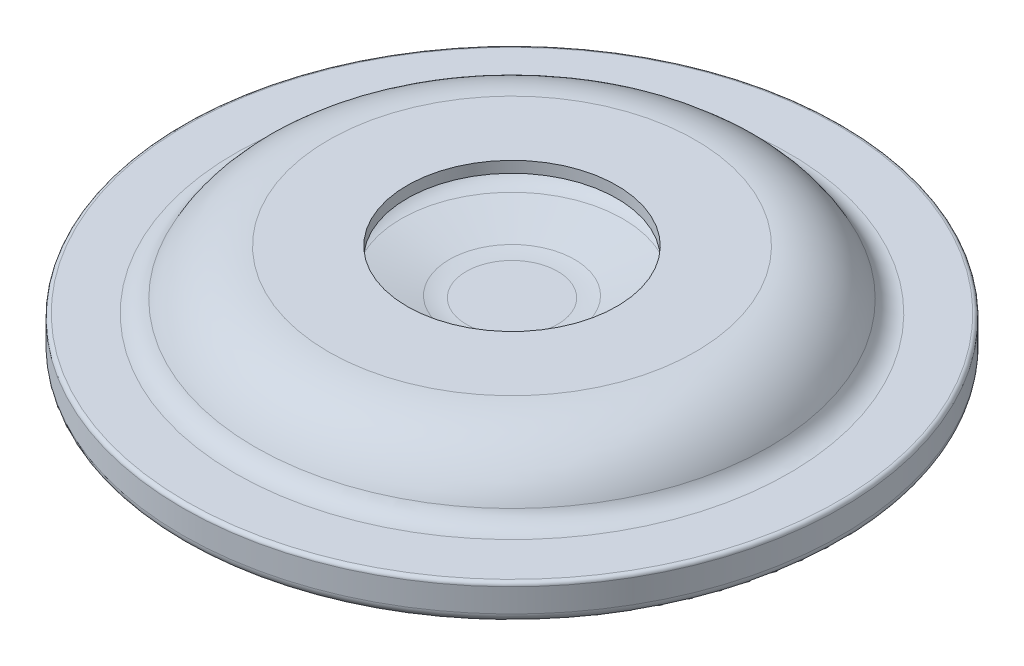
ISO-10303-21;
HEADER;
FILE_DESCRIPTION(('STEP AP214'),'2;1');
FILE_NAME('part.step','',(''),(''),'','','');
FILE_SCHEMA(('AUTOMOTIVE_DESIGN { 1 0 10303 214 1 1 1 1 }'));
ENDSEC;
DATA;
#1=APPLICATION_CONTEXT('core data for automotive mechanical design processes');
#2=APPLICATION_PROTOCOL_DEFINITION('international standard','automotive_design',2000,#1);
#3=PRODUCT_CONTEXT('',#1,'mechanical');
#4=PRODUCT('Part','Part','',(#3));
#5=PRODUCT_RELATED_PRODUCT_CATEGORY('part','',(#4));
#6=PRODUCT_DEFINITION_FORMATION('','',#4);
#7=PRODUCT_DEFINITION_CONTEXT('part definition',#1,'design');
#8=PRODUCT_DEFINITION('design','',#6,#7);
#9=PRODUCT_DEFINITION_SHAPE('','',#8);
#10=(LENGTH_UNIT() NAMED_UNIT(*) SI_UNIT(.MILLI.,.METRE.));
#11=(NAMED_UNIT(*) PLANE_ANGLE_UNIT() SI_UNIT($,.RADIAN.));
#12=(NAMED_UNIT(*) SI_UNIT($,.STERADIAN.) SOLID_ANGLE_UNIT());
#13=UNCERTAINTY_MEASURE_WITH_UNIT(LENGTH_MEASURE(1.E-05),#10,'distance_accuracy_value','');
#14=(GEOMETRIC_REPRESENTATION_CONTEXT(3) GLOBAL_UNCERTAINTY_ASSIGNED_CONTEXT((#13)) GLOBAL_UNIT_ASSIGNED_CONTEXT((#10,
#11,#12)) REPRESENTATION_CONTEXT('',''));
#15=CARTESIAN_POINT('',(0.,0.,0.));
#16=DIRECTION('',(0.,0.,1.));
#17=DIRECTION('',(1.,0.,0.));
#18=AXIS2_PLACEMENT_3D('',#15,#16,#17);
#19=CARTESIAN_POINT('',(0.,-5.45,0.));
#20=DIRECTION('',(0.,1.,0.));
#21=DIRECTION('',(0.,0.,1.));
#22=AXIS2_PLACEMENT_3D('',#19,#20,#21);
#23=TOROIDAL_SURFACE('',#22,42.75,1.25);
#24=CARTESIAN_POINT('',(0.,-5.45,0.));
#25=DIRECTION('',(0.,1.,0.));
#26=DIRECTION('',(0.,0.,1.));
#27=AXIS2_PLACEMENT_3D('',#24,#25,#26);
#28=CIRCLE('',#27,44.);
#29=CARTESIAN_POINT('',(0.,-5.45,44.));
#30=VERTEX_POINT('',#29);
#31=EDGE_CURVE('E121',#30,#30,#28,.T.);
#32=ORIENTED_EDGE('',*,*,#31,.F.);
#33=EDGE_LOOP('',(#32));
#34=FACE_BOUND('',#33,.T.);
#35=CARTESIAN_POINT('',(0.,-6.7,0.));
#36=DIRECTION('',(0.,1.,0.));
#37=DIRECTION('',(0.,0.,1.));
#38=AXIS2_PLACEMENT_3D('',#35,#36,#37);
#39=CIRCLE('',#38,42.75);
#40=CARTESIAN_POINT('',(0.,-6.7,42.75));
#41=VERTEX_POINT('',#40);
#42=EDGE_CURVE('E10',#41,#41,#39,.T.);
#43=ORIENTED_EDGE('',*,*,#42,.T.);
#44=EDGE_LOOP('',(#43));
#45=FACE_BOUND('',#44,.T.);
#46=ADVANCED_FACE('F39',(#34,#45),#23,.T.);
#47=CARTESIAN_POINT('',(39.5,-6.7,0.));
#48=DIRECTION('',(0.,1.,0.));
#49=DIRECTION('',(0.,0.,1.));
#50=AXIS2_PLACEMENT_3D('',#47,#48,#49);
#51=PLANE('',#50);
#52=ORIENTED_EDGE('',*,*,#42,.F.);
#53=EDGE_LOOP('',(#52));
#54=FACE_BOUND('',#53,.T.);
#55=CARTESIAN_POINT('',(0.,-6.7,0.));
#56=DIRECTION('',(0.,1.,0.));
#57=DIRECTION('',(0.,0.,1.));
#58=AXIS2_PLACEMENT_3D('',#55,#56,#57);
#59=CIRCLE('',#58,39.5);
#60=CARTESIAN_POINT('',(0.,-6.7,39.5));
#61=VERTEX_POINT('',#60);
#62=EDGE_CURVE('E45',#61,#61,#59,.T.);
#63=ORIENTED_EDGE('',*,*,#62,.T.);
#64=EDGE_LOOP('',(#63));
#65=FACE_BOUND('',#64,.T.);
#66=ADVANCED_FACE('F128',(#54,#65),#51,.F.);
#67=CARTESIAN_POINT('',(0.,-6.2,0.));
#68=DIRECTION('',(0.,1.,0.));
#69=DIRECTION('',(0.,0.,1.));
#70=AXIS2_PLACEMENT_3D('',#67,#68,#69);
#71=TOROIDAL_SURFACE('',#70,39.5,0.5);
#72=ORIENTED_EDGE('',*,*,#62,.F.);
#73=EDGE_LOOP('',(#72));
#74=FACE_BOUND('',#73,.T.);
#75=CARTESIAN_POINT('',(0.,-6.2,0.));
#76=DIRECTION('',(0.,1.,0.));
#77=DIRECTION('',(0.,0.,1.));
#78=AXIS2_PLACEMENT_3D('',#75,#76,#77);
#79=CIRCLE('',#78,39.);
#80=CARTESIAN_POINT('',(0.,-6.2,39.));
#81=VERTEX_POINT('',#80);
#82=EDGE_CURVE('E49',#81,#81,#79,.T.);
#83=ORIENTED_EDGE('',*,*,#82,.T.);
#84=EDGE_LOOP('',(#83));
#85=FACE_BOUND('',#84,.T.);
#86=ADVANCED_FACE('F132',(#74,#85),#71,.T.);
#87=CARTESIAN_POINT('',(0.,0.,0.));
#88=DIRECTION('',(0.,1.,0.));
#89=DIRECTION('',(0.,0.,1.));
#90=AXIS2_PLACEMENT_3D('',#87,#88,#89);
#91=CYLINDRICAL_SURFACE('',#90,39.);
#92=ORIENTED_EDGE('',*,*,#82,.F.);
#93=EDGE_LOOP('',(#92));
#94=FACE_BOUND('',#93,.T.);
#95=CARTESIAN_POINT('',(0.,-4.55,0.));
#96=DIRECTION('',(0.,1.,0.));
#97=DIRECTION('',(0.,0.,1.));
#98=AXIS2_PLACEMENT_3D('',#95,#96,#97);
#99=CIRCLE('',#98,39.);
#100=CARTESIAN_POINT('',(0.,-4.55,39.));
#101=VERTEX_POINT('',#100);
#102=EDGE_CURVE('E53',#101,#101,#99,.T.);
#103=ORIENTED_EDGE('',*,*,#102,.T.);
#104=EDGE_LOOP('',(#103));
#105=FACE_BOUND('',#104,.T.);
#106=ADVANCED_FACE('F137',(#94,#105),#91,.F.);
#107=CARTESIAN_POINT('',(0.,-4.55,0.));
#108=DIRECTION('',(0.,1.,0.));
#109=DIRECTION('',(0.,0.,1.));
#110=AXIS2_PLACEMENT_3D('',#107,#108,#109);
#111=TOROIDAL_SURFACE('',#110,37.75,1.25);
#112=ORIENTED_EDGE('',*,*,#102,.F.);
#113=EDGE_LOOP('',(#112));
#114=FACE_BOUND('',#113,.T.);
#115=CARTESIAN_POINT('',(0.,-3.3,0.));
#116=DIRECTION('',(0.,1.,0.));
#117=DIRECTION('',(0.,0.,1.));
#118=AXIS2_PLACEMENT_3D('',#115,#116,#117);
#119=CIRCLE('',#118,37.75);
#120=CARTESIAN_POINT('',(0.,-3.3,37.75));
#121=VERTEX_POINT('',#120);
#122=EDGE_CURVE('E58',#121,#121,#119,.T.);
#123=ORIENTED_EDGE('',*,*,#122,.T.);
#124=EDGE_LOOP('',(#123));
#125=FACE_BOUND('',#124,.T.);
#126=ADVANCED_FACE('F143',(#114,#125),#111,.F.);
#127=CARTESIAN_POINT('',(37.75,-3.3,0.));
#128=DIRECTION('',(0.,1.,0.));
#129=DIRECTION('',(0.,0.,1.));
#130=AXIS2_PLACEMENT_3D('',#127,#128,#129);
#131=PLANE('',#130);
#132=ORIENTED_EDGE('',*,*,#122,.F.);
#133=EDGE_LOOP('',(#132));
#134=FACE_BOUND('',#133,.T.);
#135=CARTESIAN_POINT('',(0.,-3.3,0.));
#136=DIRECTION('',(0.,1.,0.));
#137=DIRECTION('',(0.,0.,1.));
#138=AXIS2_PLACEMENT_3D('',#135,#136,#137);
#139=CIRCLE('',#138,36.7342603844383);
#140=CARTESIAN_POINT('',(0.,-3.3,36.7342603844383));
#141=VERTEX_POINT('',#140);
#142=EDGE_CURVE('E61',#141,#141,#139,.T.);
#143=ORIENTED_EDGE('',*,*,#142,.T.);
#144=EDGE_LOOP('',(#143));
#145=FACE_BOUND('',#144,.T.);
#146=ADVANCED_FACE('F147',(#134,#145),#131,.F.);
#147=CARTESIAN_POINT('',(0.,1.2,0.));
#148=DIRECTION('',(0.,1.,0.));
#149=DIRECTION('',(0.,0.,1.));
#150=AXIS2_PLACEMENT_3D('',#147,#148,#149);
#151=TOROIDAL_SURFACE('',#150,36.7342603844383,4.5);
#152=ORIENTED_EDGE('',*,*,#142,.F.);
#153=EDGE_LOOP('',(#152));
#154=FACE_BOUND('',#153,.T.);
#155=CARTESIAN_POINT('',(0.,-0.983606557377049,0.));
#156=DIRECTION('',(0.,1.,0.));
#157=DIRECTION('',(0.,0.,1.));
#158=AXIS2_PLACEMENT_3D('',#155,#156,#157);
#159=CIRCLE('',#158,32.7995605988663);
#160=CARTESIAN_POINT('',(0.,-0.983606557377049,32.7995605988663));
#161=VERTEX_POINT('',#160);
#162=EDGE_CURVE('E64',#161,#161,#159,.T.);
#163=ORIENTED_EDGE('',*,*,#162,.T.);
#164=EDGE_LOOP('',(#163));
#165=FACE_BOUND('',#164,.T.);
#166=ADVANCED_FACE('F151',(#154,#165),#151,.T.);
#167=CARTESIAN_POINT('',(0.,-6.2,0.));
#168=DIRECTION('',(0.,1.,0.));
#169=DIRECTION('',(0.,0.,1.));
#170=AXIS2_PLACEMENT_3D('',#167,#168,#169);
#171=TOROIDAL_SURFACE('',#170,23.4,10.75);
#172=ORIENTED_EDGE('',*,*,#162,.F.);
#173=EDGE_LOOP('',(#172));
#174=FACE_BOUND('',#173,.T.);
#175=CARTESIAN_POINT('',(0.,4.34871095033932,0.));
#176=DIRECTION('',(0.,1.,0.));
#177=DIRECTION('',(0.,0.,1.));
#178=AXIS2_PLACEMENT_3D('',#175,#176,#177);
#179=CIRCLE('',#178,25.4705548256908);
#180=CARTESIAN_POINT('',(0.,4.34871095033932,25.4705548256908));
#181=VERTEX_POINT('',#180);
#182=EDGE_CURVE('E67',#181,#181,#179,.T.);
#183=ORIENTED_EDGE('',*,*,#182,.T.);
#184=EDGE_LOOP('',(#183));
#185=FACE_BOUND('',#184,.T.);
#186=ADVANCED_FACE('F155',(#174,#185),#171,.F.);
#187=CARTESIAN_POINT('',(0.,-3.75516488877807,0.));
#188=DIRECTION('',(0.,1.,0.));
#189=DIRECTION('',(0.,0.,1.));
#190=AXIS2_PLACEMENT_3D('',#187,#188,#189);
#191=TOROIDAL_SURFACE('',#190,23.8798847140082,8.25851288187109);
#192=ORIENTED_EDGE('',*,*,#182,.F.);
#193=EDGE_LOOP('',(#192));
#194=FACE_BOUND('',#193,.T.);
#195=CARTESIAN_POINT('',(0.,4.2450311794086,0.));
#196=DIRECTION('',(0.,1.,0.));
#197=DIRECTION('',(0.,0.,1.));
#198=AXIS2_PLACEMENT_3D('',#195,#196,#197);
#199=CIRCLE('',#198,21.8305194731101);
#200=CARTESIAN_POINT('',(0.,4.2450311794086,21.8305194731101));
#201=VERTEX_POINT('',#200);
#202=EDGE_CURVE('E70',#201,#201,#199,.T.);
#203=ORIENTED_EDGE('',*,*,#202,.T.);
#204=EDGE_LOOP('',(#203));
#205=FACE_BOUND('',#204,.T.);
#206=ADVANCED_FACE('F159',(#194,#205),#191,.F.);
#207=CARTESIAN_POINT('',(0.,-5.2,0.));
#208=DIRECTION('',(0.,1.,0.));
#209=DIRECTION('',(0.,0.,1.));
#210=AXIS2_PLACEMENT_3D('',#207,#208,#209);
#211=TOROIDAL_SURFACE('',#210,24.25,9.75);
#212=ORIENTED_EDGE('',*,*,#202,.F.);
#213=EDGE_LOOP('',(#212));
#214=FACE_BOUND('',#213,.T.);
#215=CARTESIAN_POINT('',(0.,1.50114153430654,0.));
#216=DIRECTION('',(0.,1.,0.));
#217=DIRECTION('',(0.,0.,1.));
#218=AXIS2_PLACEMENT_3D('',#215,#216,#217);
#219=CIRCLE('',#218,17.1678250418963);
#220=CARTESIAN_POINT('',(0.,1.50114153430654,17.1678250418963));
#221=VERTEX_POINT('',#220);
#222=EDGE_CURVE('E73',#221,#221,#219,.T.);
#223=ORIENTED_EDGE('',*,*,#222,.T.);
#224=EDGE_LOOP('',(#223));
#225=FACE_BOUND('',#224,.T.);
#226=ADVANCED_FACE('F163',(#214,#225),#211,.F.);
#227=CARTESIAN_POINT('',(0.,5.28127265622304,0.));
#228=DIRECTION('',(0.,1.,0.));
#229=DIRECTION('',(0.,0.,1.));
#230=AXIS2_PLACEMENT_3D('',#227,#228,#229);
#231=TOROIDAL_SURFACE('',#230,13.172751988607,5.5);
#232=ORIENTED_EDGE('',*,*,#222,.F.);
#233=EDGE_LOOP('',(#232));
#234=FACE_BOUND('',#233,.T.);
#235=CARTESIAN_POINT('',(0.,0.547367819885276,0.));
#236=DIRECTION('',(0.,1.,0.));
#237=DIRECTION('',(0.,0.,1.));
#238=AXIS2_PLACEMENT_3D('',#235,#236,#237);
#239=CIRCLE('',#238,15.9727778814333);
#240=CARTESIAN_POINT('',(0.,0.547367819885276,15.9727778814333));
#241=VERTEX_POINT('',#240);
#242=EDGE_CURVE('E76',#241,#241,#239,.T.);
#243=ORIENTED_EDGE('',*,*,#242,.T.);
#244=EDGE_LOOP('',(#243));
#245=FACE_BOUND('',#244,.T.);
#246=ADVANCED_FACE('F167',(#234,#245),#231,.T.);
#247=CARTESIAN_POINT('',(0.,9.8,0.));
#248=DIRECTION('',(0.,1.,0.));
#249=DIRECTION('',(0.,0.,1.));
#250=AXIS2_PLACEMENT_3D('',#247,#248,#249);
#251=DEGENERATE_TOROIDAL_SURFACE('',#250,10.5,10.75,.T.);
#252=ORIENTED_EDGE('',*,*,#242,.F.);
#253=EDGE_LOOP('',(#252));
#254=FACE_BOUND('',#253,.T.);
#255=CARTESIAN_POINT('',(0.,-0.753609959137586,0.));
#256=DIRECTION('',(0.,1.,0.));
#257=DIRECTION('',(0.,0.,1.));
#258=AXIS2_PLACEMENT_3D('',#255,#256,#257);
#259=CIRCLE('',#258,12.5454380534232);
#260=CARTESIAN_POINT('',(0.,-0.753609959137586,12.5454380534232));
#261=VERTEX_POINT('',#260);
#262=EDGE_CURVE('E79',#261,#261,#259,.T.);
#263=ORIENTED_EDGE('',*,*,#262,.T.);
#264=EDGE_LOOP('',(#263));
#265=FACE_BOUND('',#264,.T.);
#266=ADVANCED_FACE('F171',(#254,#265),#251,.T.);
#267=CARTESIAN_POINT('',(0.,-1.33199073922455,0.));
#268=DIRECTION('',(0.,1.,0.));
#269=DIRECTION('',(0.,0.,1.));
#270=AXIS2_PLACEMENT_3D('',#267,#268,#269);
#271=CONICAL_SURFACE('',#270,9.56123369158309,1.3793557945538);
#272=ORIENTED_EDGE('',*,*,#262,.F.);
#273=EDGE_LOOP('',(#272));
#274=FACE_BOUND('',#273,.T.);
#275=CARTESIAN_POINT('',(0.,-1.33199073922455,0.));
#276=DIRECTION('',(0.,1.,0.));
#277=DIRECTION('',(0.,0.,1.));
#278=AXIS2_PLACEMENT_3D('',#275,#276,#277);
#279=CIRCLE('',#278,9.56123369158309);
#280=CARTESIAN_POINT('',(0.,-1.33199073922455,9.56123369158309));
#281=VERTEX_POINT('',#280);
#282=EDGE_CURVE('E82',#281,#281,#279,.T.);
#283=ORIENTED_EDGE('',*,*,#282,.T.);
#284=EDGE_LOOP('',(#283));
#285=FACE_BOUND('',#284,.T.);
#286=ADVANCED_FACE('F175',(#274,#285),#271,.T.);
#287=CARTESIAN_POINT('',(0.,48.,0.));
#288=DIRECTION('',(0.,1.,0.));
#289=DIRECTION('',(1.,0.,0.));
#290=AXIS2_PLACEMENT_3D('',#287,#288,#289);
#291=SPHERICAL_SURFACE('',#290,50.25);
#292=ORIENTED_EDGE('',*,*,#282,.F.);
#293=EDGE_LOOP('',(#292));
#294=FACE_BOUND('',#293,.T.);
#295=ADVANCED_FACE('F179',(#294),#291,.T.);
#296=CARTESIAN_POINT('',(6.11064391698354,0.,0.));
#297=DIRECTION('',(0.,-1.,0.));
#298=DIRECTION('',(0.,0.,-1.));
#299=AXIS2_PLACEMENT_3D('',#296,#297,#298);
#300=PLANE('',#299);
#301=CARTESIAN_POINT('',(0.,0.,0.));
#302=DIRECTION('',(0.,1.,0.));
#303=DIRECTION('',(0.,0.,1.));
#304=AXIS2_PLACEMENT_3D('',#301,#302,#303);
#305=CIRCLE('',#304,6.11064391698354);
#306=CARTESIAN_POINT('',(0.,0.,6.11064391698354));
#307=VERTEX_POINT('',#306);
#308=EDGE_CURVE('E85',#307,#307,#305,.T.);
#309=ORIENTED_EDGE('',*,*,#308,.T.);
#310=EDGE_LOOP('',(#309));
#311=FACE_BOUND('',#310,.T.);
#312=ADVANCED_FACE('F183',(#311),#300,.F.);
#313=CARTESIAN_POINT('',(0.,10.,0.));
#314=DIRECTION('',(0.,1.,0.));
#315=DIRECTION('',(0.,0.,1.));
#316=AXIS2_PLACEMENT_3D('',#313,#314,#315);
#317=DEGENERATE_TOROIDAL_SURFACE('',#316,6.11064391698354,10.,.T.);
#318=ORIENTED_EDGE('',*,*,#308,.F.);
#319=EDGE_LOOP('',(#318));
#320=FACE_BOUND('',#319,.T.);
#321=CARTESIAN_POINT('',(0.,0.256299352147648,0.));
#322=DIRECTION('',(0.,1.,0.));
#323=DIRECTION('',(0.,0.,1.));
#324=AXIS2_PLACEMENT_3D('',#321,#322,#323);
#325=CIRCLE('',#324,8.36015446042219);
#326=CARTESIAN_POINT('',(0.,0.256299352147648,8.36015446042219));
#327=VERTEX_POINT('',#326);
#328=EDGE_CURVE('E88',#327,#327,#325,.T.);
#329=ORIENTED_EDGE('',*,*,#328,.T.);
#330=EDGE_LOOP('',(#329));
#331=FACE_BOUND('',#330,.T.);
#332=ADVANCED_FACE('F187',(#320,#331),#317,.F.);
#333=CARTESIAN_POINT('',(0.,1.74306239572235,0.));
#334=DIRECTION('',(0.,1.,0.));
#335=DIRECTION('',(0.,0.,1.));
#336=AXIS2_PLACEMENT_3D('',#333,#334,#335);
#337=CONICAL_SURFACE('',#336,14.8000327144433,1.34390352403563);
#338=ORIENTED_EDGE('',*,*,#328,.F.);
#339=EDGE_LOOP('',(#338));
#340=FACE_BOUND('',#339,.T.);
#341=CARTESIAN_POINT('',(0.,1.74306239572235,0.));
#342=DIRECTION('',(0.,1.,0.));
#343=DIRECTION('',(0.,0.,1.));
#344=AXIS2_PLACEMENT_3D('',#341,#342,#343);
#345=CIRCLE('',#344,14.8000327144433);
#346=CARTESIAN_POINT('',(0.,1.74306239572235,14.8000327144433));
#347=VERTEX_POINT('',#346);
#348=EDGE_CURVE('E91',#347,#347,#345,.T.);
#349=ORIENTED_EDGE('',*,*,#348,.T.);
#350=EDGE_LOOP('',(#349));
#351=FACE_BOUND('',#350,.T.);
#352=ADVANCED_FACE('F191',(#340,#351),#337,.F.);
#353=CARTESIAN_POINT('',(0.,4.66617259007806,0.));
#354=DIRECTION('',(0.,1.,0.));
#355=DIRECTION('',(0.,0.,1.));
#356=AXIS2_PLACEMENT_3D('',#353,#354,#355);
#357=TOROIDAL_SURFACE('',#356,14.1251795514117,3.);
#358=ORIENTED_EDGE('',*,*,#348,.F.);
#359=EDGE_LOOP('',(#358));
#360=FACE_BOUND('',#359,.T.);
#361=CARTESIAN_POINT('',(0.,2.91691370496097,0.));
#362=DIRECTION('',(0.,1.,0.));
#363=DIRECTION('',(0.,0.,1.));
#364=AXIS2_PLACEMENT_3D('',#361,#362,#363);
#365=CIRCLE('',#364,16.5624102242941);
#366=CARTESIAN_POINT('',(0.,2.91691370496097,16.5624102242941));
#367=VERTEX_POINT('',#366);
#368=EDGE_CURVE('E94',#367,#367,#365,.T.);
#369=ORIENTED_EDGE('',*,*,#368,.T.);
#370=EDGE_LOOP('',(#369));
#371=FACE_BOUND('',#370,.T.);
#372=ADVANCED_FACE('F195',(#360,#371),#357,.F.);
#373=CARTESIAN_POINT('',(0.,3.5,0.));
#374=DIRECTION('',(0.,1.,0.));
#375=DIRECTION('',(0.,0.,1.));
#376=AXIS2_PLACEMENT_3D('',#373,#374,#375);
#377=TOROIDAL_SURFACE('',#376,15.75,1.);
#378=ORIENTED_EDGE('',*,*,#368,.F.);
#379=EDGE_LOOP('',(#378));
#380=FACE_BOUND('',#379,.T.);
#381=CARTESIAN_POINT('',(0.,4.5,0.));
#382=DIRECTION('',(0.,1.,0.));
#383=DIRECTION('',(0.,0.,1.));
#384=AXIS2_PLACEMENT_3D('',#381,#382,#383);
#385=CIRCLE('',#384,15.75);
#386=CARTESIAN_POINT('',(0.,4.5,15.75));
#387=VERTEX_POINT('',#386);
#388=EDGE_CURVE('E97',#387,#387,#385,.T.);
#389=ORIENTED_EDGE('',*,*,#388,.T.);
#390=EDGE_LOOP('',(#389));
#391=FACE_BOUND('',#390,.T.);
#392=ADVANCED_FACE('F199',(#380,#391),#377,.F.);
#393=CARTESIAN_POINT('',(14.,4.5,0.));
#394=DIRECTION('',(0.,1.,0.));
#395=DIRECTION('',(0.,0.,1.));
#396=AXIS2_PLACEMENT_3D('',#393,#394,#395);
#397=PLANE('',#396);
#398=ORIENTED_EDGE('',*,*,#388,.F.);
#399=EDGE_LOOP('',(#398));
#400=FACE_BOUND('',#399,.T.);
#401=CARTESIAN_POINT('',(0.,4.5,0.));
#402=DIRECTION('',(0.,1.,0.));
#403=DIRECTION('',(0.,0.,1.));
#404=AXIS2_PLACEMENT_3D('',#401,#402,#403);
#405=CIRCLE('',#404,14.);
#406=CARTESIAN_POINT('',(0.,4.5,14.));
#407=VERTEX_POINT('',#406);
#408=EDGE_CURVE('E100',#407,#407,#405,.T.);
#409=ORIENTED_EDGE('',*,*,#408,.T.);
#410=EDGE_LOOP('',(#409));
#411=FACE_BOUND('',#410,.T.);
#412=ADVANCED_FACE('F203',(#400,#411),#397,.F.);
#413=CARTESIAN_POINT('',(0.,0.,0.));
#414=DIRECTION('',(0.,1.,0.));
#415=DIRECTION('',(0.,0.,1.));
#416=AXIS2_PLACEMENT_3D('',#413,#414,#415);
#417=CYLINDRICAL_SURFACE('',#416,14.);
#418=ORIENTED_EDGE('',*,*,#408,.F.);
#419=EDGE_LOOP('',(#418));
#420=FACE_BOUND('',#419,.T.);
#421=CARTESIAN_POINT('',(0.,6.,0.));
#422=DIRECTION('',(0.,1.,0.));
#423=DIRECTION('',(0.,0.,1.));
#424=AXIS2_PLACEMENT_3D('',#421,#422,#423);
#425=CIRCLE('',#424,14.);
#426=CARTESIAN_POINT('',(0.,6.,14.));
#427=VERTEX_POINT('',#426);
#428=EDGE_CURVE('E103',#427,#427,#425,.T.);
#429=ORIENTED_EDGE('',*,*,#428,.T.);
#430=EDGE_LOOP('',(#429));
#431=FACE_BOUND('',#430,.T.);
#432=ADVANCED_FACE('F207',(#420,#431),#417,.F.);
#433=CARTESIAN_POINT('',(14.,6.,0.));
#434=DIRECTION('',(0.,-1.,0.));
#435=DIRECTION('',(0.,0.,-1.));
#436=AXIS2_PLACEMENT_3D('',#433,#434,#435);
#437=PLANE('',#436);
#438=ORIENTED_EDGE('',*,*,#428,.F.);
#439=EDGE_LOOP('',(#438));
#440=FACE_BOUND('',#439,.T.);
#441=CARTESIAN_POINT('',(0.,6.,0.));
#442=DIRECTION('',(0.,1.,0.));
#443=DIRECTION('',(0.,0.,1.));
#444=AXIS2_PLACEMENT_3D('',#441,#442,#443);
#445=CIRCLE('',#444,24.5);
#446=CARTESIAN_POINT('',(0.,6.,24.5));
#447=VERTEX_POINT('',#446);
#448=EDGE_CURVE('E106',#447,#447,#445,.T.);
#449=ORIENTED_EDGE('',*,*,#448,.T.);
#450=EDGE_LOOP('',(#449));
#451=FACE_BOUND('',#450,.T.);
#452=ADVANCED_FACE('F211',(#440,#451),#437,.F.);
#453=CARTESIAN_POINT('',(0.,-4.9,0.));
#454=DIRECTION('',(0.,1.,0.));
#455=DIRECTION('',(0.,0.,1.));
#456=AXIS2_PLACEMENT_3D('',#453,#454,#455);
#457=TOROIDAL_SURFACE('',#456,24.5,10.9);
#458=ORIENTED_EDGE('',*,*,#448,.F.);
#459=EDGE_LOOP('',(#458));
#460=FACE_BOUND('',#459,.T.);
#461=CARTESIAN_POINT('',(0.,-0.116546762589929,0.));
#462=DIRECTION('',(0.,1.,0.));
#463=DIRECTION('',(0.,0.,1.));
#464=AXIS2_PLACEMENT_3D('',#461,#462,#463);
#465=CIRCLE('',#464,34.2943134075601);
#466=CARTESIAN_POINT('',(0.,-0.116546762589929,34.2943134075601));
#467=VERTEX_POINT('',#466);
#468=EDGE_CURVE('E109',#467,#467,#465,.T.);
#469=ORIENTED_EDGE('',*,*,#468,.T.);
#470=EDGE_LOOP('',(#469));
#471=FACE_BOUND('',#470,.T.);
#472=ADVANCED_FACE('F215',(#460,#471),#457,.T.);
#473=CARTESIAN_POINT('',(0.,1.2,0.));
#474=DIRECTION('',(0.,1.,0.));
#475=DIRECTION('',(0.,0.,1.));
#476=AXIS2_PLACEMENT_3D('',#473,#474,#475);
#477=TOROIDAL_SURFACE('',#476,36.9899959967968,3.);
#478=ORIENTED_EDGE('',*,*,#468,.F.);
#479=EDGE_LOOP('',(#478));
#480=FACE_BOUND('',#479,.T.);
#481=CARTESIAN_POINT('',(0.,-1.8,0.));
#482=DIRECTION('',(0.,1.,0.));
#483=DIRECTION('',(0.,0.,1.));
#484=AXIS2_PLACEMENT_3D('',#481,#482,#483);
#485=CIRCLE('',#484,36.9899959967968);
#486=CARTESIAN_POINT('',(0.,-1.8,36.9899959967968));
#487=VERTEX_POINT('',#486);
#488=EDGE_CURVE('E112',#487,#487,#485,.T.);
#489=ORIENTED_EDGE('',*,*,#488,.T.);
#490=EDGE_LOOP('',(#489));
#491=FACE_BOUND('',#490,.T.);
#492=ADVANCED_FACE('F219',(#480,#491),#477,.F.);
#493=CARTESIAN_POINT('',(36.9899959967968,-1.8,0.));
#494=DIRECTION('',(0.,-1.,0.));
#495=DIRECTION('',(0.,0.,-1.));
#496=AXIS2_PLACEMENT_3D('',#493,#494,#495);
#497=PLANE('',#496);
#498=ORIENTED_EDGE('',*,*,#488,.F.);
#499=EDGE_LOOP('',(#498));
#500=FACE_BOUND('',#499,.T.);
#501=CARTESIAN_POINT('',(0.,-1.8,0.));
#502=DIRECTION('',(0.,1.,0.));
#503=DIRECTION('',(0.,0.,1.));
#504=AXIS2_PLACEMENT_3D('',#501,#502,#503);
#505=CIRCLE('',#504,43.5);
#506=CARTESIAN_POINT('',(0.,-1.8,43.5));
#507=VERTEX_POINT('',#506);
#508=EDGE_CURVE('E115',#507,#507,#505,.T.);
#509=ORIENTED_EDGE('',*,*,#508,.T.);
#510=EDGE_LOOP('',(#509));
#511=FACE_BOUND('',#510,.T.);
#512=ADVANCED_FACE('F223',(#500,#511),#497,.F.);
#513=CARTESIAN_POINT('',(0.,-2.3,0.));
#514=DIRECTION('',(0.,1.,0.));
#515=DIRECTION('',(0.,0.,1.));
#516=AXIS2_PLACEMENT_3D('',#513,#514,#515);
#517=TOROIDAL_SURFACE('',#516,43.5,0.5);
#518=ORIENTED_EDGE('',*,*,#508,.F.);
#519=EDGE_LOOP('',(#518));
#520=FACE_BOUND('',#519,.T.);
#521=CARTESIAN_POINT('',(0.,-2.3,0.));
#522=DIRECTION('',(0.,1.,0.));
#523=DIRECTION('',(0.,0.,1.));
#524=AXIS2_PLACEMENT_3D('',#521,#522,#523);
#525=CIRCLE('',#524,44.);
#526=CARTESIAN_POINT('',(0.,-2.3,44.));
#527=VERTEX_POINT('',#526);
#528=EDGE_CURVE('E118',#527,#527,#525,.T.);
#529=ORIENTED_EDGE('',*,*,#528,.T.);
#530=EDGE_LOOP('',(#529));
#531=FACE_BOUND('',#530,.T.);
#532=ADVANCED_FACE('F227',(#520,#531),#517,.T.);
#533=CARTESIAN_POINT('',(0.,0.,0.));
#534=DIRECTION('',(0.,1.,0.));
#535=DIRECTION('',(0.,0.,1.));
#536=AXIS2_PLACEMENT_3D('',#533,#534,#535);
#537=CYLINDRICAL_SURFACE('',#536,44.);
#538=ORIENTED_EDGE('',*,*,#528,.F.);
#539=EDGE_LOOP('',(#538));
#540=FACE_BOUND('',#539,.T.);
#541=ORIENTED_EDGE('',*,*,#31,.T.);
#542=EDGE_LOOP('',(#541));
#543=FACE_BOUND('',#542,.T.);
#544=ADVANCED_FACE('F125',(#540,#543),#537,.T.);
#545=CLOSED_SHELL('',(#46,#66,#86,#106,#126,#146,#166,#186,#206,#226,#246,#266,#286,#295,#312,
#332,#352,#372,#392,#412,#432,#452,#472,#492,#512,#532,#544));
#546=MANIFOLD_SOLID_BREP('B2',#545);
#547=ADVANCED_BREP_SHAPE_REPRESENTATION('',(#18,#546),#14);
#548=SHAPE_DEFINITION_REPRESENTATION(#9,#547);
ENDSEC;
END-ISO-10303-21;
